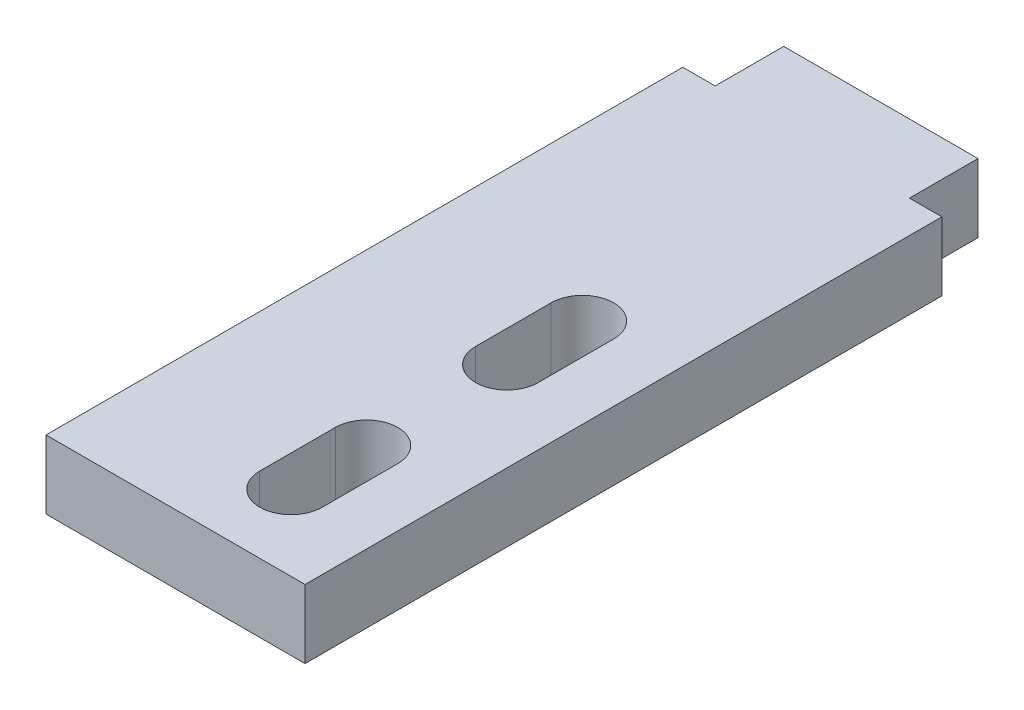
ISO-10303-21;
HEADER;
FILE_DESCRIPTION(('STEP AP214'),'2;1');
FILE_NAME('part.step','',(''),(''),'','','');
FILE_SCHEMA(('AUTOMOTIVE_DESIGN { 1 0 10303 214 1 1 1 1 }'));
ENDSEC;
DATA;
#1=APPLICATION_CONTEXT('core data for automotive mechanical design processes');
#2=APPLICATION_PROTOCOL_DEFINITION('international standard','automotive_design',2000,#1);
#3=PRODUCT_CONTEXT('',#1,'mechanical');
#4=PRODUCT('Part','Part','',(#3));
#5=PRODUCT_RELATED_PRODUCT_CATEGORY('part','',(#4));
#6=PRODUCT_DEFINITION_FORMATION('','',#4);
#7=PRODUCT_DEFINITION_CONTEXT('part definition',#1,'design');
#8=PRODUCT_DEFINITION('design','',#6,#7);
#9=PRODUCT_DEFINITION_SHAPE('','',#8);
#10=(LENGTH_UNIT() NAMED_UNIT(*) SI_UNIT(.MILLI.,.METRE.));
#11=(NAMED_UNIT(*) PLANE_ANGLE_UNIT() SI_UNIT($,.RADIAN.));
#12=(NAMED_UNIT(*) SI_UNIT($,.STERADIAN.) SOLID_ANGLE_UNIT());
#13=UNCERTAINTY_MEASURE_WITH_UNIT(LENGTH_MEASURE(1.E-05),#10,'distance_accuracy_value','');
#14=(GEOMETRIC_REPRESENTATION_CONTEXT(3) GLOBAL_UNCERTAINTY_ASSIGNED_CONTEXT((#13)) GLOBAL_UNIT_ASSIGNED_CONTEXT((#10,
#11,#12)) REPRESENTATION_CONTEXT('',''));
#15=CARTESIAN_POINT('',(0.,0.,0.));
#16=DIRECTION('',(0.,0.,1.));
#17=DIRECTION('',(1.,0.,0.));
#18=AXIS2_PLACEMENT_3D('',#15,#16,#17);
#19=CARTESIAN_POINT('',(0.,3.175,0.));
#20=DIRECTION('',(0.,1.,0.));
#21=DIRECTION('',(0.,0.,1.));
#22=AXIS2_PLACEMENT_3D('',#19,#20,#21);
#23=PLANE('',#22);
#24=DIRECTION('',(0.,0.,1.));
#25=VECTOR('',#24,1.);
#26=CARTESIAN_POINT('',(-32.35,3.175,-19.25));
#27=LINE('',#26,#25);
#28=CARTESIAN_POINT('',(-32.35,3.175,-19.25));
#29=VERTEX_POINT('',#28);
#30=CARTESIAN_POINT('',(-32.35,3.175,10.25));
#31=VERTEX_POINT('',#30);
#32=EDGE_CURVE('E213',#29,#31,#27,.T.);
#33=ORIENTED_EDGE('',*,*,#32,.T.);
#34=DIRECTION('',(1.,0.,0.));
#35=VECTOR('',#34,1.);
#36=CARTESIAN_POINT('',(-32.35,3.175,10.25));
#37=LINE('',#36,#35);
#38=CARTESIAN_POINT('',(-20.35,3.175,10.25));
#39=VERTEX_POINT('',#38);
#40=EDGE_CURVE('E216',#31,#39,#37,.T.);
#41=ORIENTED_EDGE('',*,*,#40,.T.);
#42=DIRECTION('',(0.,0.,-1.));
#43=VECTOR('',#42,1.);
#44=CARTESIAN_POINT('',(-20.35,3.175,10.25));
#45=LINE('',#44,#43);
#46=CARTESIAN_POINT('',(-20.35,3.175,-19.25));
#47=VERTEX_POINT('',#46);
#48=EDGE_CURVE('E219',#39,#47,#45,.T.);
#49=ORIENTED_EDGE('',*,*,#48,.T.);
#50=DIRECTION('',(-1.,0.,0.));
#51=VECTOR('',#50,1.);
#52=CARTESIAN_POINT('',(-20.35,3.175,-19.25));
#53=LINE('',#52,#51);
#54=CARTESIAN_POINT('',(-21.85,3.175,-19.25));
#55=VERTEX_POINT('',#54);
#56=EDGE_CURVE('E221',#47,#55,#53,.T.);
#57=ORIENTED_EDGE('',*,*,#56,.T.);
#58=DIRECTION('',(0.,0.,-1.));
#59=VECTOR('',#58,1.);
#60=CARTESIAN_POINT('',(-21.85,3.175,-19.25));
#61=LINE('',#60,#59);
#62=CARTESIAN_POINT('',(-21.85,3.175,-22.425));
#63=VERTEX_POINT('',#62);
#64=EDGE_CURVE('E223',#55,#63,#61,.T.);
#65=ORIENTED_EDGE('',*,*,#64,.T.);
#66=DIRECTION('',(-1.,0.,0.));
#67=VECTOR('',#66,1.);
#68=CARTESIAN_POINT('',(-30.85,3.175,-22.425));
#69=LINE('',#68,#67);
#70=CARTESIAN_POINT('',(-30.85,3.175,-22.425));
#71=VERTEX_POINT('',#70);
#72=EDGE_CURVE('E225',#63,#71,#69,.T.);
#73=ORIENTED_EDGE('',*,*,#72,.T.);
#74=DIRECTION('',(0.,0.,1.));
#75=VECTOR('',#74,1.);
#76=CARTESIAN_POINT('',(-30.85,3.175,-19.25));
#77=LINE('',#76,#75);
#78=CARTESIAN_POINT('',(-30.85,3.175,-19.25));
#79=VERTEX_POINT('',#78);
#80=EDGE_CURVE('E227',#71,#79,#77,.T.);
#81=ORIENTED_EDGE('',*,*,#80,.T.);
#82=DIRECTION('',(-1.,0.,0.));
#83=VECTOR('',#82,1.);
#84=CARTESIAN_POINT('',(-30.85,3.175,-19.25));
#85=LINE('',#84,#83);
#86=EDGE_CURVE('E229',#79,#29,#85,.T.);
#87=ORIENTED_EDGE('',*,*,#86,.T.);
#88=EDGE_LOOP('',(#33,#41,#49,#57,#65,#73,#81,#87));
#89=FACE_BOUND('',#88,.T.);
#90=DIRECTION('',(0.,0.,-1.));
#91=VECTOR('',#90,1.);
#92=CARTESIAN_POINT('',(-23.05,3.175,-3.25));
#93=LINE('',#92,#91);
#94=CARTESIAN_POINT('',(-23.05,3.175,-3.25));
#95=VERTEX_POINT('',#94);
#96=CARTESIAN_POINT('',(-23.05,3.175,-6.75));
#97=VERTEX_POINT('',#96);
#98=EDGE_CURVE('E184',#95,#97,#93,.T.);
#99=ORIENTED_EDGE('',*,*,#98,.F.);
#100=CARTESIAN_POINT('',(-24.5,3.175,-3.25));
#101=DIRECTION('',(0.,1.,0.));
#102=DIRECTION('',(0.,0.,1.));
#103=AXIS2_PLACEMENT_3D('',#100,#101,#102);
#104=CIRCLE('',#103,1.45);
#105=CARTESIAN_POINT('',(-25.95,3.175,-3.25));
#106=VERTEX_POINT('',#105);
#107=EDGE_CURVE('E182',#106,#95,#104,.T.);
#108=ORIENTED_EDGE('',*,*,#107,.F.);
#109=DIRECTION('',(0.,0.,1.));
#110=VECTOR('',#109,1.);
#111=CARTESIAN_POINT('',(-25.95,3.175,-3.25));
#112=LINE('',#111,#110);
#113=CARTESIAN_POINT('',(-25.95,3.175,-6.75));
#114=VERTEX_POINT('',#113);
#115=EDGE_CURVE('E190',#114,#106,#112,.T.);
#116=ORIENTED_EDGE('',*,*,#115,.F.);
#117=CARTESIAN_POINT('',(-24.5,3.175,-6.75));
#118=DIRECTION('',(0.,1.,0.));
#119=DIRECTION('',(0.,0.,1.));
#120=AXIS2_PLACEMENT_3D('',#117,#118,#119);
#121=CIRCLE('',#120,1.45);
#122=EDGE_CURVE('E187',#97,#114,#121,.T.);
#123=ORIENTED_EDGE('',*,*,#122,.F.);
#124=EDGE_LOOP('',(#99,#108,#116,#123));
#125=FACE_BOUND('',#124,.T.);
#126=DIRECTION('',(0.,0.,-1.));
#127=VECTOR('',#126,1.);
#128=CARTESIAN_POINT('',(-23.05,3.175,6.75));
#129=LINE('',#128,#127);
#130=CARTESIAN_POINT('',(-23.05,3.175,6.75));
#131=VERTEX_POINT('',#130);
#132=CARTESIAN_POINT('',(-23.05,3.175,3.25));
#133=VERTEX_POINT('',#132);
#134=EDGE_CURVE('E154',#131,#133,#129,.T.);
#135=ORIENTED_EDGE('',*,*,#134,.F.);
#136=CARTESIAN_POINT('',(-24.5,3.175,6.75));
#137=DIRECTION('',(0.,1.,0.));
#138=DIRECTION('',(0.,0.,1.));
#139=AXIS2_PLACEMENT_3D('',#136,#137,#138);
#140=CIRCLE('',#139,1.45);
#141=CARTESIAN_POINT('',(-25.95,3.175,6.75));
#142=VERTEX_POINT('',#141);
#143=EDGE_CURVE('E146',#142,#131,#140,.T.);
#144=ORIENTED_EDGE('',*,*,#143,.F.);
#145=DIRECTION('',(0.,0.,1.));
#146=VECTOR('',#145,1.);
#147=CARTESIAN_POINT('',(-25.95,3.175,6.75));
#148=LINE('',#147,#146);
#149=CARTESIAN_POINT('',(-25.95,3.175,3.25));
#150=VERTEX_POINT('',#149);
#151=EDGE_CURVE('E168',#150,#142,#148,.T.);
#152=ORIENTED_EDGE('',*,*,#151,.F.);
#153=CARTESIAN_POINT('',(-24.5,3.175,3.25));
#154=DIRECTION('',(0.,1.,0.));
#155=DIRECTION('',(0.,0.,1.));
#156=AXIS2_PLACEMENT_3D('',#153,#154,#155);
#157=CIRCLE('',#156,1.45);
#158=EDGE_CURVE('E166',#133,#150,#157,.T.);
#159=ORIENTED_EDGE('',*,*,#158,.F.);
#160=EDGE_LOOP('',(#135,#144,#152,#159));
#161=FACE_BOUND('',#160,.T.);
#162=ADVANCED_FACE('F33',(#89,#125,#161),#23,.T.);
#163=CARTESIAN_POINT('',(0.,0.,0.));
#164=DIRECTION('',(0.,1.,0.));
#165=DIRECTION('',(0.,0.,1.));
#166=AXIS2_PLACEMENT_3D('',#163,#164,#165);
#167=PLANE('',#166);
#168=CARTESIAN_POINT('',(-24.5,0.,-3.25));
#169=DIRECTION('',(0.,1.,0.));
#170=DIRECTION('',(0.,0.,1.));
#171=AXIS2_PLACEMENT_3D('',#168,#169,#170);
#172=CIRCLE('',#171,1.45);
#173=CARTESIAN_POINT('',(-25.95,0.,-3.25));
#174=VERTEX_POINT('',#173);
#175=CARTESIAN_POINT('',(-23.05,0.,-3.25));
#176=VERTEX_POINT('',#175);
#177=EDGE_CURVE('E162',#174,#176,#172,.T.);
#178=ORIENTED_EDGE('',*,*,#177,.T.);
#179=DIRECTION('',(0.,0.,-1.));
#180=VECTOR('',#179,1.);
#181=CARTESIAN_POINT('',(-23.05,0.,-3.25));
#182=LINE('',#181,#180);
#183=CARTESIAN_POINT('',(-23.05,0.,-6.75));
#184=VERTEX_POINT('',#183);
#185=EDGE_CURVE('E195',#176,#184,#182,.T.);
#186=ORIENTED_EDGE('',*,*,#185,.T.);
#187=CARTESIAN_POINT('',(-24.5,0.,-6.75));
#188=DIRECTION('',(0.,1.,0.));
#189=DIRECTION('',(0.,0.,1.));
#190=AXIS2_PLACEMENT_3D('',#187,#188,#189);
#191=CIRCLE('',#190,1.45);
#192=CARTESIAN_POINT('',(-25.95,0.,-6.75));
#193=VERTEX_POINT('',#192);
#194=EDGE_CURVE('E198',#184,#193,#191,.T.);
#195=ORIENTED_EDGE('',*,*,#194,.T.);
#196=DIRECTION('',(0.,0.,1.));
#197=VECTOR('',#196,1.);
#198=CARTESIAN_POINT('',(-25.95,0.,-3.25));
#199=LINE('',#198,#197);
#200=EDGE_CURVE('E185',#193,#174,#199,.T.);
#201=ORIENTED_EDGE('',*,*,#200,.T.);
#202=EDGE_LOOP('',(#178,#186,#195,#201));
#203=FACE_BOUND('',#202,.T.);
#204=DIRECTION('',(0.,0.,1.));
#205=VECTOR('',#204,1.);
#206=CARTESIAN_POINT('',(-32.35,0.,-19.25));
#207=LINE('',#206,#205);
#208=CARTESIAN_POINT('',(-32.35,0.,-19.25));
#209=VERTEX_POINT('',#208);
#210=CARTESIAN_POINT('',(-32.35,0.,10.25));
#211=VERTEX_POINT('',#210);
#212=EDGE_CURVE('E212',#209,#211,#207,.T.);
#213=ORIENTED_EDGE('',*,*,#212,.F.);
#214=DIRECTION('',(-1.,0.,0.));
#215=VECTOR('',#214,1.);
#216=CARTESIAN_POINT('',(-30.85,0.,-19.25));
#217=LINE('',#216,#215);
#218=CARTESIAN_POINT('',(-30.85,0.,-19.25));
#219=VERTEX_POINT('',#218);
#220=EDGE_CURVE('E217',#219,#209,#217,.T.);
#221=ORIENTED_EDGE('',*,*,#220,.F.);
#222=DIRECTION('',(0.,0.,1.));
#223=VECTOR('',#222,1.);
#224=CARTESIAN_POINT('',(-30.85,0.,-19.25));
#225=LINE('',#224,#223);
#226=CARTESIAN_POINT('',(-30.85,0.,-22.425));
#227=VERTEX_POINT('',#226);
#228=EDGE_CURVE('E244',#227,#219,#225,.T.);
#229=ORIENTED_EDGE('',*,*,#228,.F.);
#230=DIRECTION('',(-1.,0.,0.));
#231=VECTOR('',#230,1.);
#232=CARTESIAN_POINT('',(-30.85,0.,-22.425));
#233=LINE('',#232,#231);
#234=CARTESIAN_POINT('',(-21.85,0.,-22.425));
#235=VERTEX_POINT('',#234);
#236=EDGE_CURVE('E242',#235,#227,#233,.T.);
#237=ORIENTED_EDGE('',*,*,#236,.F.);
#238=DIRECTION('',(0.,0.,-1.));
#239=VECTOR('',#238,1.);
#240=CARTESIAN_POINT('',(-21.85,0.,-19.25));
#241=LINE('',#240,#239);
#242=CARTESIAN_POINT('',(-21.85,0.,-19.25));
#243=VERTEX_POINT('',#242);
#244=EDGE_CURVE('E240',#243,#235,#241,.T.);
#245=ORIENTED_EDGE('',*,*,#244,.F.);
#246=DIRECTION('',(-1.,0.,0.));
#247=VECTOR('',#246,1.);
#248=CARTESIAN_POINT('',(-20.35,0.,-19.25));
#249=LINE('',#248,#247);
#250=CARTESIAN_POINT('',(-20.35,0.,-19.25));
#251=VERTEX_POINT('',#250);
#252=EDGE_CURVE('E238',#251,#243,#249,.T.);
#253=ORIENTED_EDGE('',*,*,#252,.F.);
#254=DIRECTION('',(0.,0.,-1.));
#255=VECTOR('',#254,1.);
#256=CARTESIAN_POINT('',(-20.35,0.,10.25));
#257=LINE('',#256,#255);
#258=CARTESIAN_POINT('',(-20.35,0.,10.25));
#259=VERTEX_POINT('',#258);
#260=EDGE_CURVE('E236',#259,#251,#257,.T.);
#261=ORIENTED_EDGE('',*,*,#260,.F.);
#262=DIRECTION('',(1.,0.,0.));
#263=VECTOR('',#262,1.);
#264=CARTESIAN_POINT('',(-32.35,0.,10.25));
#265=LINE('',#264,#263);
#266=EDGE_CURVE('E234',#211,#259,#265,.T.);
#267=ORIENTED_EDGE('',*,*,#266,.F.);
#268=EDGE_LOOP('',(#213,#221,#229,#237,#245,#253,#261,#267));
#269=FACE_BOUND('',#268,.T.);
#270=CARTESIAN_POINT('',(-24.5,0.,6.75));
#271=DIRECTION('',(0.,1.,0.));
#272=DIRECTION('',(0.,0.,1.));
#273=AXIS2_PLACEMENT_3D('',#270,#271,#272);
#274=CIRCLE('',#273,1.45);
#275=CARTESIAN_POINT('',(-25.95,0.,6.75));
#276=VERTEX_POINT('',#275);
#277=CARTESIAN_POINT('',(-23.05,0.,6.75));
#278=VERTEX_POINT('',#277);
#279=EDGE_CURVE('E56',#276,#278,#274,.T.);
#280=ORIENTED_EDGE('',*,*,#279,.T.);
#281=DIRECTION('',(0.,0.,-1.));
#282=VECTOR('',#281,1.);
#283=CARTESIAN_POINT('',(-23.05,0.,6.75));
#284=LINE('',#283,#282);
#285=CARTESIAN_POINT('',(-23.05,0.,3.25));
#286=VERTEX_POINT('',#285);
#287=EDGE_CURVE('E161',#278,#286,#284,.T.);
#288=ORIENTED_EDGE('',*,*,#287,.T.);
#289=CARTESIAN_POINT('',(-24.5,0.,3.25));
#290=DIRECTION('',(0.,1.,0.));
#291=DIRECTION('',(0.,0.,1.));
#292=AXIS2_PLACEMENT_3D('',#289,#290,#291);
#293=CIRCLE('',#292,1.45);
#294=CARTESIAN_POINT('',(-25.95,0.,3.25));
#295=VERTEX_POINT('',#294);
#296=EDGE_CURVE('E174',#286,#295,#293,.T.);
#297=ORIENTED_EDGE('',*,*,#296,.T.);
#298=DIRECTION('',(0.,0.,1.));
#299=VECTOR('',#298,1.);
#300=CARTESIAN_POINT('',(-25.95,0.,6.75));
#301=LINE('',#300,#299);
#302=EDGE_CURVE('E155',#295,#276,#301,.T.);
#303=ORIENTED_EDGE('',*,*,#302,.T.);
#304=EDGE_LOOP('',(#280,#288,#297,#303));
#305=FACE_BOUND('',#304,.T.);
#306=ADVANCED_FACE('F274',(#203,#269,#305),#167,.F.);
#307=CARTESIAN_POINT('',(-32.35,3.175,-19.25));
#308=DIRECTION('',(1.,0.,0.));
#309=DIRECTION('',(0.,0.,-1.));
#310=AXIS2_PLACEMENT_3D('',#307,#308,#309);
#311=PLANE('',#310);
#312=ORIENTED_EDGE('',*,*,#212,.T.);
#313=DIRECTION('',(0.,-1.,0.));
#314=VECTOR('',#313,1.);
#315=CARTESIAN_POINT('',(-32.35,3.175,10.25));
#316=LINE('',#315,#314);
#317=EDGE_CURVE('E11',#31,#211,#316,.T.);
#318=ORIENTED_EDGE('',*,*,#317,.F.);
#319=ORIENTED_EDGE('',*,*,#32,.F.);
#320=DIRECTION('',(0.,-1.,0.));
#321=VECTOR('',#320,1.);
#322=CARTESIAN_POINT('',(-32.35,3.175,-19.25));
#323=LINE('',#322,#321);
#324=EDGE_CURVE('E231',#29,#209,#323,.T.);
#325=ORIENTED_EDGE('',*,*,#324,.T.);
#326=EDGE_LOOP('',(#312,#318,#319,#325));
#327=FACE_BOUND('',#326,.T.);
#328=ADVANCED_FACE('F35',(#327),#311,.F.);
#329=CARTESIAN_POINT('',(-32.35,3.175,10.25));
#330=DIRECTION('',(0.,0.,-1.));
#331=DIRECTION('',(-1.,0.,0.));
#332=AXIS2_PLACEMENT_3D('',#329,#330,#331);
#333=PLANE('',#332);
#334=ORIENTED_EDGE('',*,*,#266,.T.);
#335=DIRECTION('',(0.,-1.,0.));
#336=VECTOR('',#335,1.);
#337=CARTESIAN_POINT('',(-20.35,3.175,10.25));
#338=LINE('',#337,#336);
#339=EDGE_CURVE('E41',#39,#259,#338,.T.);
#340=ORIENTED_EDGE('',*,*,#339,.F.);
#341=ORIENTED_EDGE('',*,*,#40,.F.);
#342=ORIENTED_EDGE('',*,*,#317,.T.);
#343=EDGE_LOOP('',(#334,#340,#341,#342));
#344=FACE_BOUND('',#343,.T.);
#345=ADVANCED_FACE('F292',(#344),#333,.F.);
#346=CARTESIAN_POINT('',(-20.35,3.175,10.25));
#347=DIRECTION('',(-1.,0.,0.));
#348=DIRECTION('',(0.,0.,1.));
#349=AXIS2_PLACEMENT_3D('',#346,#347,#348);
#350=PLANE('',#349);
#351=ORIENTED_EDGE('',*,*,#260,.T.);
#352=DIRECTION('',(0.,-1.,0.));
#353=VECTOR('',#352,1.);
#354=CARTESIAN_POINT('',(-20.35,3.175,-19.25));
#355=LINE('',#354,#353);
#356=EDGE_CURVE('E261',#47,#251,#355,.T.);
#357=ORIENTED_EDGE('',*,*,#356,.F.);
#358=ORIENTED_EDGE('',*,*,#48,.F.);
#359=ORIENTED_EDGE('',*,*,#339,.T.);
#360=EDGE_LOOP('',(#351,#357,#358,#359));
#361=FACE_BOUND('',#360,.T.);
#362=ADVANCED_FACE('F268',(#361),#350,.F.);
#363=CARTESIAN_POINT('',(-20.35,3.175,-19.25));
#364=DIRECTION('',(0.,0.,1.));
#365=DIRECTION('',(1.,0.,0.));
#366=AXIS2_PLACEMENT_3D('',#363,#364,#365);
#367=PLANE('',#366);
#368=ORIENTED_EDGE('',*,*,#252,.T.);
#369=DIRECTION('',(0.,-1.,0.));
#370=VECTOR('',#369,1.);
#371=CARTESIAN_POINT('',(-21.85,3.175,-19.25));
#372=LINE('',#371,#370);
#373=EDGE_CURVE('E258',#55,#243,#372,.T.);
#374=ORIENTED_EDGE('',*,*,#373,.F.);
#375=ORIENTED_EDGE('',*,*,#56,.F.);
#376=ORIENTED_EDGE('',*,*,#356,.T.);
#377=EDGE_LOOP('',(#368,#374,#375,#376));
#378=FACE_BOUND('',#377,.T.);
#379=ADVANCED_FACE('F280',(#378),#367,.F.);
#380=CARTESIAN_POINT('',(-21.85,3.175,-19.25));
#381=DIRECTION('',(-1.,0.,0.));
#382=DIRECTION('',(0.,0.,1.));
#383=AXIS2_PLACEMENT_3D('',#380,#381,#382);
#384=PLANE('',#383);
#385=ORIENTED_EDGE('',*,*,#244,.T.);
#386=DIRECTION('',(0.,-1.,0.));
#387=VECTOR('',#386,1.);
#388=CARTESIAN_POINT('',(-21.85,3.175,-22.425));
#389=LINE('',#388,#387);
#390=EDGE_CURVE('E255',#63,#235,#389,.T.);
#391=ORIENTED_EDGE('',*,*,#390,.F.);
#392=ORIENTED_EDGE('',*,*,#64,.F.);
#393=ORIENTED_EDGE('',*,*,#373,.T.);
#394=EDGE_LOOP('',(#385,#391,#392,#393));
#395=FACE_BOUND('',#394,.T.);
#396=ADVANCED_FACE('F284',(#395),#384,.F.);
#397=CARTESIAN_POINT('',(-30.85,3.175,-22.425));
#398=DIRECTION('',(0.,0.,1.));
#399=DIRECTION('',(1.,0.,0.));
#400=AXIS2_PLACEMENT_3D('',#397,#398,#399);
#401=PLANE('',#400);
#402=ORIENTED_EDGE('',*,*,#236,.T.);
#403=DIRECTION('',(0.,-1.,0.));
#404=VECTOR('',#403,1.);
#405=CARTESIAN_POINT('',(-30.85,3.175,-22.425));
#406=LINE('',#405,#404);
#407=EDGE_CURVE('E252',#71,#227,#406,.T.);
#408=ORIENTED_EDGE('',*,*,#407,.F.);
#409=ORIENTED_EDGE('',*,*,#72,.F.);
#410=ORIENTED_EDGE('',*,*,#390,.T.);
#411=EDGE_LOOP('',(#402,#408,#409,#410));
#412=FACE_BOUND('',#411,.T.);
#413=ADVANCED_FACE('F305',(#412),#401,.F.);
#414=CARTESIAN_POINT('',(-30.85,3.175,-19.25));
#415=DIRECTION('',(1.,0.,0.));
#416=DIRECTION('',(0.,0.,-1.));
#417=AXIS2_PLACEMENT_3D('',#414,#415,#416);
#418=PLANE('',#417);
#419=ORIENTED_EDGE('',*,*,#228,.T.);
#420=DIRECTION('',(0.,-1.,0.));
#421=VECTOR('',#420,1.);
#422=CARTESIAN_POINT('',(-30.85,3.175,-19.25));
#423=LINE('',#422,#421);
#424=EDGE_CURVE('E249',#79,#219,#423,.T.);
#425=ORIENTED_EDGE('',*,*,#424,.F.);
#426=ORIENTED_EDGE('',*,*,#80,.F.);
#427=ORIENTED_EDGE('',*,*,#407,.T.);
#428=EDGE_LOOP('',(#419,#425,#426,#427));
#429=FACE_BOUND('',#428,.T.);
#430=ADVANCED_FACE('F303',(#429),#418,.F.);
#431=CARTESIAN_POINT('',(-30.85,3.175,-19.25));
#432=DIRECTION('',(0.,0.,1.));
#433=DIRECTION('',(1.,0.,0.));
#434=AXIS2_PLACEMENT_3D('',#431,#432,#433);
#435=PLANE('',#434);
#436=ORIENTED_EDGE('',*,*,#220,.T.);
#437=ORIENTED_EDGE('',*,*,#324,.F.);
#438=ORIENTED_EDGE('',*,*,#86,.F.);
#439=ORIENTED_EDGE('',*,*,#424,.T.);
#440=EDGE_LOOP('',(#436,#437,#438,#439));
#441=FACE_BOUND('',#440,.T.);
#442=ADVANCED_FACE('F298',(#441),#435,.F.);
#443=CARTESIAN_POINT('',(-24.5,3.175,-3.25));
#444=DIRECTION('',(0.,-1.,0.));
#445=DIRECTION('',(0.,0.,-1.));
#446=AXIS2_PLACEMENT_3D('',#443,#444,#445);
#447=CYLINDRICAL_SURFACE('',#446,1.45);
#448=ORIENTED_EDGE('',*,*,#177,.F.);
#449=DIRECTION('',(0.,-1.,0.));
#450=VECTOR('',#449,1.);
#451=CARTESIAN_POINT('',(-25.95,3.175,-3.25));
#452=LINE('',#451,#450);
#453=EDGE_CURVE('E192',#106,#174,#452,.T.);
#454=ORIENTED_EDGE('',*,*,#453,.F.);
#455=ORIENTED_EDGE('',*,*,#107,.T.);
#456=DIRECTION('',(0.,-1.,0.));
#457=VECTOR('',#456,1.);
#458=CARTESIAN_POINT('',(-23.05,3.175,-3.25));
#459=LINE('',#458,#457);
#460=EDGE_CURVE('E209',#95,#176,#459,.T.);
#461=ORIENTED_EDGE('',*,*,#460,.T.);
#462=EDGE_LOOP('',(#448,#454,#455,#461));
#463=FACE_BOUND('',#462,.T.);
#464=ADVANCED_FACE('F322',(#463),#447,.F.);
#465=CARTESIAN_POINT('',(-23.05,3.175,-3.25));
#466=DIRECTION('',(-1.,0.,0.));
#467=DIRECTION('',(0.,0.,1.));
#468=AXIS2_PLACEMENT_3D('',#465,#466,#467);
#469=PLANE('',#468);
#470=ORIENTED_EDGE('',*,*,#185,.F.);
#471=ORIENTED_EDGE('',*,*,#460,.F.);
#472=ORIENTED_EDGE('',*,*,#98,.T.);
#473=DIRECTION('',(0.,-1.,0.));
#474=VECTOR('',#473,1.);
#475=CARTESIAN_POINT('',(-23.05,3.175,-6.75));
#476=LINE('',#475,#474);
#477=EDGE_CURVE('E207',#97,#184,#476,.T.);
#478=ORIENTED_EDGE('',*,*,#477,.T.);
#479=EDGE_LOOP('',(#470,#471,#472,#478));
#480=FACE_BOUND('',#479,.T.);
#481=ADVANCED_FACE('F329',(#480),#469,.T.);
#482=CARTESIAN_POINT('',(-24.5,3.175,-6.75));
#483=DIRECTION('',(0.,-1.,0.));
#484=DIRECTION('',(0.,0.,-1.));
#485=AXIS2_PLACEMENT_3D('',#482,#483,#484);
#486=CYLINDRICAL_SURFACE('',#485,1.45);
#487=ORIENTED_EDGE('',*,*,#194,.F.);
#488=ORIENTED_EDGE('',*,*,#477,.F.);
#489=ORIENTED_EDGE('',*,*,#122,.T.);
#490=DIRECTION('',(0.,-1.,0.));
#491=VECTOR('',#490,1.);
#492=CARTESIAN_POINT('',(-25.95,3.175,-6.75));
#493=LINE('',#492,#491);
#494=EDGE_CURVE('E205',#114,#193,#493,.T.);
#495=ORIENTED_EDGE('',*,*,#494,.T.);
#496=EDGE_LOOP('',(#487,#488,#489,#495));
#497=FACE_BOUND('',#496,.T.);
#498=ADVANCED_FACE('F334',(#497),#486,.F.);
#499=CARTESIAN_POINT('',(-25.95,3.175,-3.25));
#500=DIRECTION('',(1.,0.,0.));
#501=DIRECTION('',(0.,0.,-1.));
#502=AXIS2_PLACEMENT_3D('',#499,#500,#501);
#503=PLANE('',#502);
#504=ORIENTED_EDGE('',*,*,#200,.F.);
#505=ORIENTED_EDGE('',*,*,#494,.F.);
#506=ORIENTED_EDGE('',*,*,#115,.T.);
#507=ORIENTED_EDGE('',*,*,#453,.T.);
#508=EDGE_LOOP('',(#504,#505,#506,#507));
#509=FACE_BOUND('',#508,.T.);
#510=ADVANCED_FACE('F341',(#509),#503,.T.);
#511=CARTESIAN_POINT('',(-24.5,3.175,6.75));
#512=DIRECTION('',(0.,-1.,0.));
#513=DIRECTION('',(0.,0.,-1.));
#514=AXIS2_PLACEMENT_3D('',#511,#512,#513);
#515=CYLINDRICAL_SURFACE('',#514,1.45);
#516=ORIENTED_EDGE('',*,*,#279,.F.);
#517=DIRECTION('',(0.,-1.,0.));
#518=VECTOR('',#517,1.);
#519=CARTESIAN_POINT('',(-25.95,3.175,6.75));
#520=LINE('',#519,#518);
#521=EDGE_CURVE('E150',#142,#276,#520,.T.);
#522=ORIENTED_EDGE('',*,*,#521,.F.);
#523=ORIENTED_EDGE('',*,*,#143,.T.);
#524=DIRECTION('',(0.,-1.,0.));
#525=VECTOR('',#524,1.);
#526=CARTESIAN_POINT('',(-23.05,3.175,6.75));
#527=LINE('',#526,#525);
#528=EDGE_CURVE('E149',#131,#278,#527,.T.);
#529=ORIENTED_EDGE('',*,*,#528,.T.);
#530=EDGE_LOOP('',(#516,#522,#523,#529));
#531=FACE_BOUND('',#530,.T.);
#532=ADVANCED_FACE('F148',(#531),#515,.F.);
#533=CARTESIAN_POINT('',(-23.05,3.175,6.75));
#534=DIRECTION('',(-1.,0.,0.));
#535=DIRECTION('',(0.,0.,1.));
#536=AXIS2_PLACEMENT_3D('',#533,#534,#535);
#537=PLANE('',#536);
#538=ORIENTED_EDGE('',*,*,#287,.F.);
#539=ORIENTED_EDGE('',*,*,#528,.F.);
#540=ORIENTED_EDGE('',*,*,#134,.T.);
#541=DIRECTION('',(0.,-1.,0.));
#542=VECTOR('',#541,1.);
#543=CARTESIAN_POINT('',(-23.05,3.175,3.25));
#544=LINE('',#543,#542);
#545=EDGE_CURVE('E163',#133,#286,#544,.T.);
#546=ORIENTED_EDGE('',*,*,#545,.T.);
#547=EDGE_LOOP('',(#538,#539,#540,#546));
#548=FACE_BOUND('',#547,.T.);
#549=ADVANCED_FACE('F158',(#548),#537,.T.);
#550=CARTESIAN_POINT('',(-24.5,3.175,3.25));
#551=DIRECTION('',(0.,-1.,0.));
#552=DIRECTION('',(0.,0.,-1.));
#553=AXIS2_PLACEMENT_3D('',#550,#551,#552);
#554=CYLINDRICAL_SURFACE('',#553,1.45);
#555=ORIENTED_EDGE('',*,*,#296,.F.);
#556=ORIENTED_EDGE('',*,*,#545,.F.);
#557=ORIENTED_EDGE('',*,*,#158,.T.);
#558=DIRECTION('',(0.,-1.,0.));
#559=VECTOR('',#558,1.);
#560=CARTESIAN_POINT('',(-25.95,3.175,3.25));
#561=LINE('',#560,#559);
#562=EDGE_CURVE('E48',#150,#295,#561,.T.);
#563=ORIENTED_EDGE('',*,*,#562,.T.);
#564=EDGE_LOOP('',(#555,#556,#557,#563));
#565=FACE_BOUND('',#564,.T.);
#566=ADVANCED_FACE('F359',(#565),#554,.F.);
#567=CARTESIAN_POINT('',(-25.95,3.175,6.75));
#568=DIRECTION('',(1.,0.,0.));
#569=DIRECTION('',(0.,0.,-1.));
#570=AXIS2_PLACEMENT_3D('',#567,#568,#569);
#571=PLANE('',#570);
#572=ORIENTED_EDGE('',*,*,#302,.F.);
#573=ORIENTED_EDGE('',*,*,#562,.F.);
#574=ORIENTED_EDGE('',*,*,#151,.T.);
#575=ORIENTED_EDGE('',*,*,#521,.T.);
#576=EDGE_LOOP('',(#572,#573,#574,#575));
#577=FACE_BOUND('',#576,.T.);
#578=ADVANCED_FACE('F362',(#577),#571,.T.);
#579=CLOSED_SHELL('',(#162,#306,#328,#345,#362,#379,#396,#413,#430,#442,#464,#481,#498,#510,
#532,#549,#566,#578));
#580=MANIFOLD_SOLID_BREP('B2',#579);
#581=ADVANCED_BREP_SHAPE_REPRESENTATION('',(#18,#580),#14);
#582=SHAPE_DEFINITION_REPRESENTATION(#9,#581);
ENDSEC;
END-ISO-10303-21;
